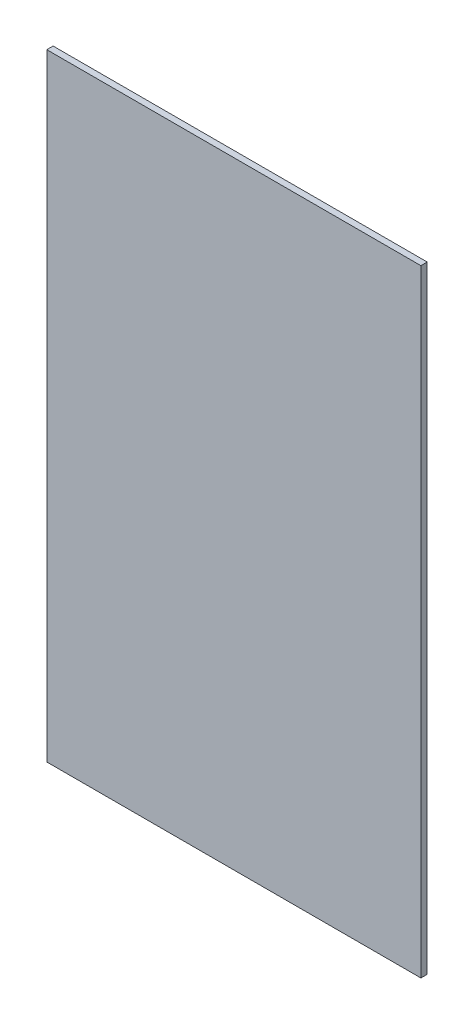
ISO-10303-21;
HEADER;
FILE_DESCRIPTION(('STEP AP214'),'2;1');
FILE_NAME('part.step','',(''),(''),'','','');
FILE_SCHEMA(('AUTOMOTIVE_DESIGN { 1 0 10303 214 1 1 1 1 }'));
ENDSEC;
DATA;
#1=APPLICATION_CONTEXT('core data for automotive mechanical design processes');
#2=APPLICATION_PROTOCOL_DEFINITION('international standard','automotive_design',2000,#1);
#3=PRODUCT_CONTEXT('',#1,'mechanical');
#4=PRODUCT('Part','Part','',(#3));
#5=PRODUCT_RELATED_PRODUCT_CATEGORY('part','',(#4));
#6=PRODUCT_DEFINITION_FORMATION('','',#4);
#7=PRODUCT_DEFINITION_CONTEXT('part definition',#1,'design');
#8=PRODUCT_DEFINITION('design','',#6,#7);
#9=PRODUCT_DEFINITION_SHAPE('','',#8);
#10=(LENGTH_UNIT() NAMED_UNIT(*) SI_UNIT(.MILLI.,.METRE.));
#11=(NAMED_UNIT(*) PLANE_ANGLE_UNIT() SI_UNIT($,.RADIAN.));
#12=(NAMED_UNIT(*) SI_UNIT($,.STERADIAN.) SOLID_ANGLE_UNIT());
#13=UNCERTAINTY_MEASURE_WITH_UNIT(LENGTH_MEASURE(1.E-05),#10,'distance_accuracy_value','');
#14=(GEOMETRIC_REPRESENTATION_CONTEXT(3) GLOBAL_UNCERTAINTY_ASSIGNED_CONTEXT((#13)) GLOBAL_UNIT_ASSIGNED_CONTEXT((#10,
#11,#12)) REPRESENTATION_CONTEXT('',''));
#15=CARTESIAN_POINT('',(0.,0.,0.));
#16=DIRECTION('',(0.,0.,1.));
#17=DIRECTION('',(1.,0.,0.));
#18=AXIS2_PLACEMENT_3D('',#15,#16,#17);
#19=CARTESIAN_POINT('',(88.5825,146.05,2.9972));
#20=DIRECTION('',(-1.,0.,0.));
#21=DIRECTION('',(0.,-1.,0.));
#22=AXIS2_PLACEMENT_3D('',#19,#20,#21);
#23=PLANE('',#22);
#24=DIRECTION('',(0.,1.,0.));
#25=VECTOR('',#24,1.);
#26=CARTESIAN_POINT('',(88.5825,146.05,0.));
#27=LINE('',#26,#25);
#28=CARTESIAN_POINT('',(88.5825,-146.05,0.));
#29=VERTEX_POINT('',#28);
#30=CARTESIAN_POINT('',(88.5825,146.05,0.));
#31=VERTEX_POINT('',#30);
#32=EDGE_CURVE('E107',#29,#31,#27,.T.);
#33=ORIENTED_EDGE('',*,*,#32,.T.);
#34=DIRECTION('',(0.,0.,-1.));
#35=VECTOR('',#34,1.);
#36=CARTESIAN_POINT('',(88.5825,146.05,2.9972));
#37=LINE('',#36,#35);
#38=CARTESIAN_POINT('',(88.5825,146.05,2.9972));
#39=VERTEX_POINT('',#38);
#40=EDGE_CURVE('E11',#39,#31,#37,.T.);
#41=ORIENTED_EDGE('',*,*,#40,.F.);
#42=DIRECTION('',(0.,1.,0.));
#43=VECTOR('',#42,1.);
#44=CARTESIAN_POINT('',(88.5825,146.05,2.9972));
#45=LINE('',#44,#43);
#46=CARTESIAN_POINT('',(88.5825,-146.05,2.9972));
#47=VERTEX_POINT('',#46);
#48=EDGE_CURVE('E91',#47,#39,#45,.T.);
#49=ORIENTED_EDGE('',*,*,#48,.F.);
#50=DIRECTION('',(0.,0.,-1.));
#51=VECTOR('',#50,1.);
#52=CARTESIAN_POINT('',(88.5825,-146.05,2.9972));
#53=LINE('',#52,#51);
#54=EDGE_CURVE('E103',#47,#29,#53,.T.);
#55=ORIENTED_EDGE('',*,*,#54,.T.);
#56=EDGE_LOOP('',(#33,#41,#49,#55));
#57=FACE_BOUND('',#56,.T.);
#58=ADVANCED_FACE('F39',(#57),#23,.F.);
#59=CARTESIAN_POINT('',(-88.5825,146.05,2.9972));
#60=DIRECTION('',(0.,-1.,0.));
#61=DIRECTION('',(0.,0.,-1.));
#62=AXIS2_PLACEMENT_3D('',#59,#60,#61);
#63=PLANE('',#62);
#64=DIRECTION('',(-1.,0.,0.));
#65=VECTOR('',#64,1.);
#66=CARTESIAN_POINT('',(-88.5825,146.05,0.));
#67=LINE('',#66,#65);
#68=CARTESIAN_POINT('',(-88.5825,146.05,0.));
#69=VERTEX_POINT('',#68);
#70=EDGE_CURVE('E96',#31,#69,#67,.T.);
#71=ORIENTED_EDGE('',*,*,#70,.T.);
#72=DIRECTION('',(0.,0.,-1.));
#73=VECTOR('',#72,1.);
#74=CARTESIAN_POINT('',(-88.5825,146.05,2.9972));
#75=LINE('',#74,#73);
#76=CARTESIAN_POINT('',(-88.5825,146.05,2.9972));
#77=VERTEX_POINT('',#76);
#78=EDGE_CURVE('E48',#77,#69,#75,.T.);
#79=ORIENTED_EDGE('',*,*,#78,.F.);
#80=DIRECTION('',(-1.,0.,0.));
#81=VECTOR('',#80,1.);
#82=CARTESIAN_POINT('',(-88.5825,146.05,2.9972));
#83=LINE('',#82,#81);
#84=EDGE_CURVE('E86',#39,#77,#83,.T.);
#85=ORIENTED_EDGE('',*,*,#84,.F.);
#86=ORIENTED_EDGE('',*,*,#40,.T.);
#87=EDGE_LOOP('',(#71,#79,#85,#86));
#88=FACE_BOUND('',#87,.T.);
#89=ADVANCED_FACE('F95',(#88),#63,.F.);
#90=CARTESIAN_POINT('',(-88.5825,146.05,2.9972));
#91=DIRECTION('',(1.,0.,0.));
#92=DIRECTION('',(0.,1.,0.));
#93=AXIS2_PLACEMENT_3D('',#90,#91,#92);
#94=PLANE('',#93);
#95=DIRECTION('',(0.,-1.,0.));
#96=VECTOR('',#95,1.);
#97=CARTESIAN_POINT('',(-88.5825,146.05,0.));
#98=LINE('',#97,#96);
#99=CARTESIAN_POINT('',(-88.5825,-146.05,0.));
#100=VERTEX_POINT('',#99);
#101=EDGE_CURVE('E73',#69,#100,#98,.T.);
#102=ORIENTED_EDGE('',*,*,#101,.T.);
#103=DIRECTION('',(0.,0.,-1.));
#104=VECTOR('',#103,1.);
#105=CARTESIAN_POINT('',(-88.5825,-146.05,2.9972));
#106=LINE('',#105,#104);
#107=CARTESIAN_POINT('',(-88.5825,-146.05,2.9972));
#108=VERTEX_POINT('',#107);
#109=EDGE_CURVE('E98',#108,#100,#106,.T.);
#110=ORIENTED_EDGE('',*,*,#109,.F.);
#111=DIRECTION('',(0.,-1.,0.));
#112=VECTOR('',#111,1.);
#113=CARTESIAN_POINT('',(-88.5825,146.05,2.9972));
#114=LINE('',#113,#112);
#115=EDGE_CURVE('E89',#77,#108,#114,.T.);
#116=ORIENTED_EDGE('',*,*,#115,.F.);
#117=ORIENTED_EDGE('',*,*,#78,.T.);
#118=EDGE_LOOP('',(#102,#110,#116,#117));
#119=FACE_BOUND('',#118,.T.);
#120=ADVANCED_FACE('F99',(#119),#94,.F.);
#121=CARTESIAN_POINT('',(-88.5825,-146.05,2.9972));
#122=DIRECTION('',(0.,1.,0.));
#123=DIRECTION('',(0.,0.,1.));
#124=AXIS2_PLACEMENT_3D('',#121,#122,#123);
#125=PLANE('',#124);
#126=DIRECTION('',(1.,0.,0.));
#127=VECTOR('',#126,1.);
#128=CARTESIAN_POINT('',(-88.5825,-146.05,0.));
#129=LINE('',#128,#127);
#130=EDGE_CURVE('E79',#100,#29,#129,.T.);
#131=ORIENTED_EDGE('',*,*,#130,.T.);
#132=ORIENTED_EDGE('',*,*,#54,.F.);
#133=DIRECTION('',(1.,0.,0.));
#134=VECTOR('',#133,1.);
#135=CARTESIAN_POINT('',(-88.5825,-146.05,2.9972));
#136=LINE('',#135,#134);
#137=EDGE_CURVE('E56',#108,#47,#136,.T.);
#138=ORIENTED_EDGE('',*,*,#137,.F.);
#139=ORIENTED_EDGE('',*,*,#109,.T.);
#140=EDGE_LOOP('',(#131,#132,#138,#139));
#141=FACE_BOUND('',#140,.T.);
#142=ADVANCED_FACE('F120',(#141),#125,.F.);
#143=CARTESIAN_POINT('',(0.,0.,2.9972));
#144=DIRECTION('',(0.,0.,1.));
#145=DIRECTION('',(1.,0.,0.));
#146=AXIS2_PLACEMENT_3D('',#143,#144,#145);
#147=PLANE('',#146);
#148=ORIENTED_EDGE('',*,*,#48,.T.);
#149=ORIENTED_EDGE('',*,*,#84,.T.);
#150=ORIENTED_EDGE('',*,*,#115,.T.);
#151=ORIENTED_EDGE('',*,*,#137,.T.);
#152=EDGE_LOOP('',(#148,#149,#150,#151));
#153=FACE_BOUND('',#152,.T.);
#154=ADVANCED_FACE('F87',(#153),#147,.T.);
#155=CARTESIAN_POINT('',(0.,0.,0.));
#156=DIRECTION('',(0.,0.,1.));
#157=DIRECTION('',(1.,0.,0.));
#158=AXIS2_PLACEMENT_3D('',#155,#156,#157);
#159=PLANE('',#158);
#160=ORIENTED_EDGE('',*,*,#32,.F.);
#161=ORIENTED_EDGE('',*,*,#130,.F.);
#162=ORIENTED_EDGE('',*,*,#101,.F.);
#163=ORIENTED_EDGE('',*,*,#70,.F.);
#164=EDGE_LOOP('',(#160,#161,#162,#163));
#165=FACE_BOUND('',#164,.T.);
#166=ADVANCED_FACE('F123',(#165),#159,.F.);
#167=CLOSED_SHELL('',(#58,#89,#120,#142,#154,#166));
#168=MANIFOLD_SOLID_BREP('B2',#167);
#169=ADVANCED_BREP_SHAPE_REPRESENTATION('',(#18,#168),#14);
#170=SHAPE_DEFINITION_REPRESENTATION(#9,#169);
ENDSEC;
END-ISO-10303-21;
